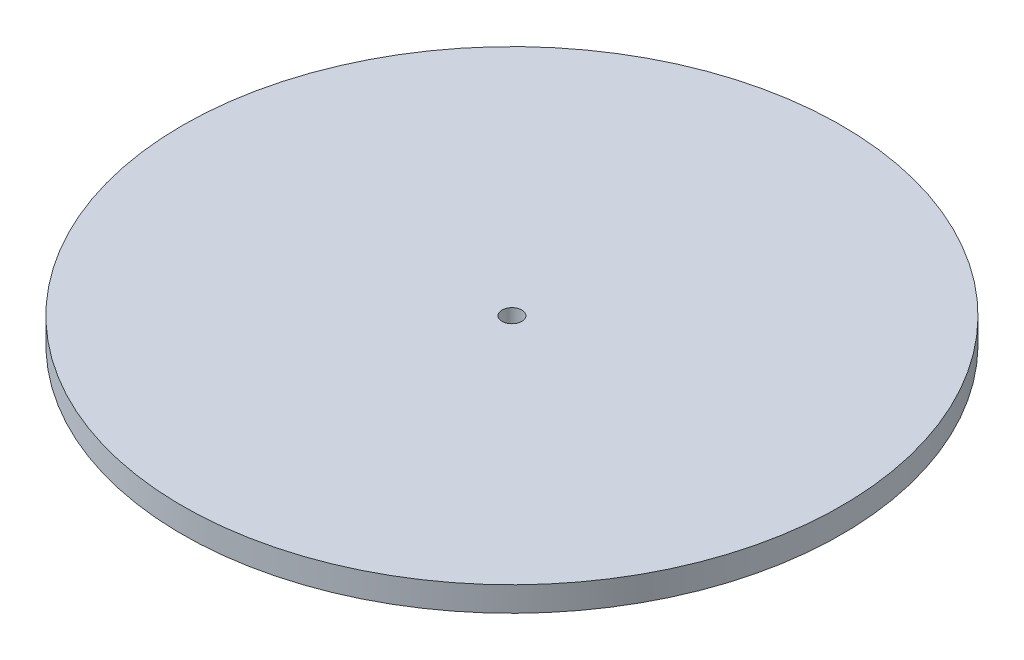
ISO-10303-21;
HEADER;
FILE_DESCRIPTION(('STEP AP214'),'2;1');
FILE_NAME('part.step','',(''),(''),'','','');
FILE_SCHEMA(('AUTOMOTIVE_DESIGN { 1 0 10303 214 1 1 1 1 }'));
ENDSEC;
DATA;
#1=APPLICATION_CONTEXT('core data for automotive mechanical design processes');
#2=APPLICATION_PROTOCOL_DEFINITION('international standard','automotive_design',2000,#1);
#3=PRODUCT_CONTEXT('',#1,'mechanical');
#4=PRODUCT('Part','Part','',(#3));
#5=PRODUCT_RELATED_PRODUCT_CATEGORY('part','',(#4));
#6=PRODUCT_DEFINITION_FORMATION('','',#4);
#7=PRODUCT_DEFINITION_CONTEXT('part definition',#1,'design');
#8=PRODUCT_DEFINITION('design','',#6,#7);
#9=PRODUCT_DEFINITION_SHAPE('','',#8);
#10=(LENGTH_UNIT() NAMED_UNIT(*) SI_UNIT(.MILLI.,.METRE.));
#11=(NAMED_UNIT(*) PLANE_ANGLE_UNIT() SI_UNIT($,.RADIAN.));
#12=(NAMED_UNIT(*) SI_UNIT($,.STERADIAN.) SOLID_ANGLE_UNIT());
#13=UNCERTAINTY_MEASURE_WITH_UNIT(LENGTH_MEASURE(1.E-05),#10,'distance_accuracy_value','');
#14=(GEOMETRIC_REPRESENTATION_CONTEXT(3) GLOBAL_UNCERTAINTY_ASSIGNED_CONTEXT((#13)) GLOBAL_UNIT_ASSIGNED_CONTEXT((#10,
#11,#12)) REPRESENTATION_CONTEXT('',''));
#15=CARTESIAN_POINT('',(0.,0.,0.));
#16=DIRECTION('',(0.,0.,1.));
#17=DIRECTION('',(1.,0.,0.));
#18=AXIS2_PLACEMENT_3D('',#15,#16,#17);
#19=CARTESIAN_POINT('',(0.,23.9472097184685,0.));
#20=DIRECTION('',(0.,1.,0.));
#21=DIRECTION('',(-1.,0.,0.));
#22=AXIS2_PLACEMENT_3D('',#19,#20,#21);
#23=CYLINDRICAL_SURFACE('',#22,40.);
#24=CARTESIAN_POINT('',(0.,23.9472097184685,0.));
#25=DIRECTION('',(0.,1.,0.));
#26=DIRECTION('',(-1.,0.,0.));
#27=AXIS2_PLACEMENT_3D('',#24,#25,#26);
#28=CIRCLE('',#27,40.);
#29=CARTESIAN_POINT('',(-40.,23.9472097184685,0.));
#30=VERTEX_POINT('',#29);
#31=EDGE_CURVE('E50',#30,#30,#28,.T.);
#32=ORIENTED_EDGE('',*,*,#31,.F.);
#33=EDGE_LOOP('',(#32));
#34=FACE_BOUND('',#33,.T.);
#35=CARTESIAN_POINT('',(0.,20.9472097184685,0.));
#36=DIRECTION('',(0.,1.,0.));
#37=DIRECTION('',(-1.,0.,0.));
#38=AXIS2_PLACEMENT_3D('',#35,#36,#37);
#39=CIRCLE('',#38,40.);
#40=CARTESIAN_POINT('',(-40.,20.9472097184685,0.));
#41=VERTEX_POINT('',#40);
#42=EDGE_CURVE('E10',#41,#41,#39,.T.);
#43=ORIENTED_EDGE('',*,*,#42,.T.);
#44=EDGE_LOOP('',(#43));
#45=FACE_BOUND('',#44,.T.);
#46=ADVANCED_FACE('F31',(#34,#45),#23,.T.);
#47=CARTESIAN_POINT('',(37.,20.9472097184685,0.));
#48=DIRECTION('',(0.,1.,0.));
#49=DIRECTION('',(-1.,0.,0.));
#50=AXIS2_PLACEMENT_3D('',#47,#48,#49);
#51=PLANE('',#50);
#52=ORIENTED_EDGE('',*,*,#42,.F.);
#53=EDGE_LOOP('',(#52));
#54=FACE_BOUND('',#53,.T.);
#55=CARTESIAN_POINT('',(0.,20.9472097184685,0.));
#56=DIRECTION('',(0.,1.,0.));
#57=DIRECTION('',(-1.,0.,0.));
#58=AXIS2_PLACEMENT_3D('',#55,#56,#57);
#59=CIRCLE('',#58,37.);
#60=CARTESIAN_POINT('',(-37.,20.9472097184685,0.));
#61=VERTEX_POINT('',#60);
#62=EDGE_CURVE('E37',#61,#61,#59,.T.);
#63=ORIENTED_EDGE('',*,*,#62,.T.);
#64=EDGE_LOOP('',(#63));
#65=FACE_BOUND('',#64,.T.);
#66=ADVANCED_FACE('F71',(#54,#65),#51,.F.);
#67=CARTESIAN_POINT('',(0.,23.9472097184685,0.));
#68=DIRECTION('',(0.,1.,0.));
#69=DIRECTION('',(-1.,0.,0.));
#70=AXIS2_PLACEMENT_3D('',#67,#68,#69);
#71=CYLINDRICAL_SURFACE('',#70,37.0000000000049);
#72=ORIENTED_EDGE('',*,*,#62,.F.);
#73=EDGE_LOOP('',(#72));
#74=FACE_BOUND('',#73,.T.);
#75=CARTESIAN_POINT('',(0.,19.9472097184737,0.));
#76=DIRECTION('',(0.,1.,0.));
#77=DIRECTION('',(-1.,0.,0.));
#78=AXIS2_PLACEMENT_3D('',#75,#76,#77);
#79=CIRCLE('',#78,37.0000000000098);
#80=CARTESIAN_POINT('',(-37.0000000000098,19.9472097184737,0.));
#81=VERTEX_POINT('',#80);
#82=EDGE_CURVE('E41',#81,#81,#79,.T.);
#83=ORIENTED_EDGE('',*,*,#82,.T.);
#84=EDGE_LOOP('',(#83));
#85=FACE_BOUND('',#84,.T.);
#86=ADVANCED_FACE('F67',(#74,#85),#71,.T.);
#87=CARTESIAN_POINT('',(-8.48659250513029E-13,0.,0.));
#88=CARTESIAN_POINT('',(4.11111115175516,-0.0662440651821893,0.));
#89=CARTESIAN_POINT('',(8.22222223746571,3.57670539272069,0.));
#90=CARTESIAN_POINT('',(12.3333333525006,5.57276304361648,0.));
#91=CARTESIAN_POINT('',(16.4444444547961,8.28428123867827,0.));
#92=CARTESIAN_POINT('',(20.5555555575617,10.9694000699868,0.));
#93=CARTESIAN_POINT('',(24.6666666705474,13.0805424124874,0.));
#94=CARTESIAN_POINT('',(28.7777777762733,15.5994047036985,0.));
#95=CARTESIAN_POINT('',(32.8888888883791,17.759964468493,0.));
#96=CARTESIAN_POINT('',(37.0000000000098,19.9472097184737,0.));
#97=B_SPLINE_CURVE_WITH_KNOTS('',9,(#87,#88,#89,#90,#91,#92,#93,#94,#95,#96),.UNSPECIFIED.,.F.,
.F.,(10,10),(0.0792502069840677,0.916390410751228),.UNSPECIFIED.);
#98=CARTESIAN_POINT('',(0.,23.9472097184685,0.));
#99=DIRECTION('',(0.,1.,0.));
#100=AXIS1_PLACEMENT('',#98,#99);
#101=SURFACE_OF_REVOLUTION('',#97,#100);
#102=CARTESIAN_POINT('',(0.,0.106800093716809,0.));
#103=DIRECTION('',(0.,1.,0.));
#104=DIRECTION('',(-1.,0.,0.));
#105=AXIS2_PLACEMENT_3D('',#102,#103,#104);
#106=CIRCLE('',#105,1.2);
#107=CARTESIAN_POINT('',(-1.2,0.106800093716809,0.));
#108=VERTEX_POINT('',#107);
#109=EDGE_CURVE('E53',#108,#108,#106,.T.);
#110=ORIENTED_EDGE('',*,*,#109,.T.);
#111=EDGE_LOOP('',(#110));
#112=FACE_BOUND('',#111,.T.);
#113=ORIENTED_EDGE('',*,*,#82,.F.);
#114=EDGE_LOOP('',(#113));
#115=FACE_BOUND('',#114,.T.);
#116=ADVANCED_FACE('F62',(#112,#115),#101,.T.);
#117=CARTESIAN_POINT('',(0.,23.9472097184685,0.));
#118=DIRECTION('',(0.,1.,0.));
#119=DIRECTION('',(-1.,0.,0.));
#120=AXIS2_PLACEMENT_3D('',#117,#118,#119);
#121=CYLINDRICAL_SURFACE('',#120,1.2);
#122=CARTESIAN_POINT('',(0.,23.9472097184685,0.));
#123=DIRECTION('',(0.,1.,0.));
#124=DIRECTION('',(-1.,0.,0.));
#125=AXIS2_PLACEMENT_3D('',#122,#123,#124);
#126=CIRCLE('',#125,1.2);
#127=CARTESIAN_POINT('',(-1.2,23.9472097184685,0.));
#128=VERTEX_POINT('',#127);
#129=EDGE_CURVE('E45',#128,#128,#126,.T.);
#130=ORIENTED_EDGE('',*,*,#129,.T.);
#131=EDGE_LOOP('',(#130));
#132=FACE_BOUND('',#131,.T.);
#133=ORIENTED_EDGE('',*,*,#109,.F.);
#134=EDGE_LOOP('',(#133));
#135=FACE_BOUND('',#134,.T.);
#136=ADVANCED_FACE('F66',(#132,#135),#121,.F.);
#137=CARTESIAN_POINT('',(40.,23.9472097184685,0.));
#138=DIRECTION('',(0.,-1.,0.));
#139=DIRECTION('',(1.,0.,0.));
#140=AXIS2_PLACEMENT_3D('',#137,#138,#139);
#141=PLANE('',#140);
#142=ORIENTED_EDGE('',*,*,#129,.F.);
#143=EDGE_LOOP('',(#142));
#144=FACE_BOUND('',#143,.T.);
#145=ORIENTED_EDGE('',*,*,#31,.T.);
#146=EDGE_LOOP('',(#145));
#147=FACE_BOUND('',#146,.T.);
#148=ADVANCED_FACE('F83',(#144,#147),#141,.F.);
#149=CLOSED_SHELL('',(#46,#66,#86,#116,#136,#148));
#150=MANIFOLD_SOLID_BREP('B2',#149);
#151=ADVANCED_BREP_SHAPE_REPRESENTATION('',(#18,#150),#14);
#152=SHAPE_DEFINITION_REPRESENTATION(#9,#151);
ENDSEC;
END-ISO-10303-21;
